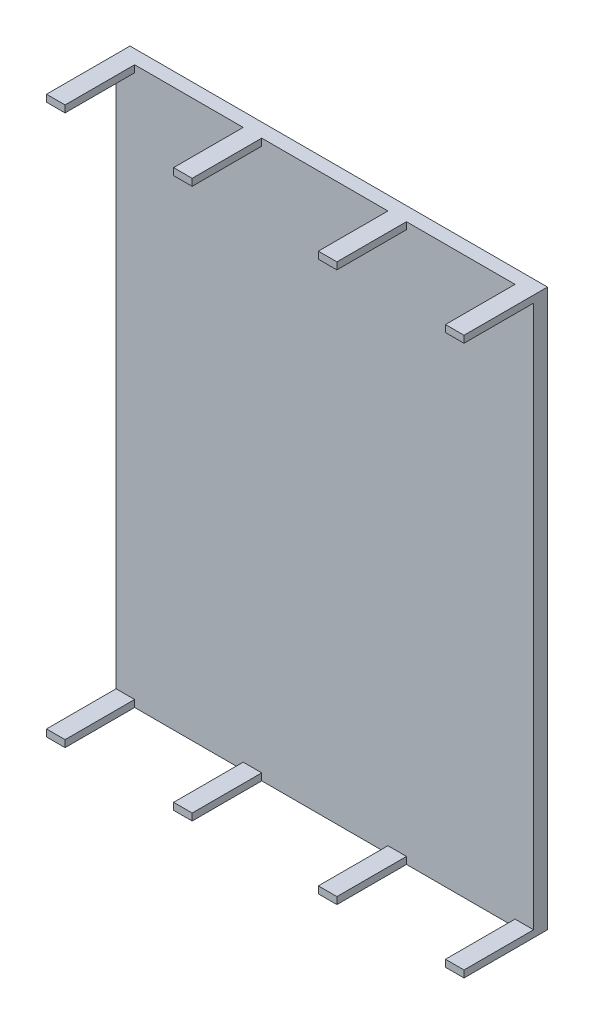
ISO-10303-21;
HEADER;
FILE_DESCRIPTION(('STEP AP214'),'2;1');
FILE_NAME('part.step','',(''),(''),'','','');
FILE_SCHEMA(('AUTOMOTIVE_DESIGN { 1 0 10303 214 1 1 1 1 }'));
ENDSEC;
DATA;
#1=APPLICATION_CONTEXT('core data for automotive mechanical design processes');
#2=APPLICATION_PROTOCOL_DEFINITION('international standard','automotive_design',2000,#1);
#3=PRODUCT_CONTEXT('',#1,'mechanical');
#4=PRODUCT('Part','Part','',(#3));
#5=PRODUCT_RELATED_PRODUCT_CATEGORY('part','',(#4));
#6=PRODUCT_DEFINITION_FORMATION('','',#4);
#7=PRODUCT_DEFINITION_CONTEXT('part definition',#1,'design');
#8=PRODUCT_DEFINITION('design','',#6,#7);
#9=PRODUCT_DEFINITION_SHAPE('','',#8);
#10=(LENGTH_UNIT() NAMED_UNIT(*) SI_UNIT(.MILLI.,.METRE.));
#11=(NAMED_UNIT(*) PLANE_ANGLE_UNIT() SI_UNIT($,.RADIAN.));
#12=(NAMED_UNIT(*) SI_UNIT($,.STERADIAN.) SOLID_ANGLE_UNIT());
#13=UNCERTAINTY_MEASURE_WITH_UNIT(LENGTH_MEASURE(1.E-05),#10,'distance_accuracy_value','');
#14=(GEOMETRIC_REPRESENTATION_CONTEXT(3) GLOBAL_UNCERTAINTY_ASSIGNED_CONTEXT((#13)) GLOBAL_UNIT_ASSIGNED_CONTEXT((#10,
#11,#12)) REPRESENTATION_CONTEXT('',''));
#15=CARTESIAN_POINT('',(0.,0.,0.));
#16=DIRECTION('',(0.,0.,1.));
#17=DIRECTION('',(1.,0.,0.));
#18=AXIS2_PLACEMENT_3D('',#15,#16,#17);
#19=CARTESIAN_POINT('',(0.,0.,3.));
#20=DIRECTION('',(0.,0.,1.));
#21=DIRECTION('',(1.,0.,0.));
#22=AXIS2_PLACEMENT_3D('',#19,#20,#21);
#23=PLANE('',#22);
#24=DIRECTION('',(0.,-1.,0.));
#25=VECTOR('',#24,1.);
#26=CARTESIAN_POINT('',(-90.,0.,3.));
#27=LINE('',#26,#25);
#28=CARTESIAN_POINT('',(-90.,-1.5,3.));
#29=VERTEX_POINT('',#28);
#30=CARTESIAN_POINT('',(-90.,-118.5,3.));
#31=VERTEX_POINT('',#30);
#32=EDGE_CURVE('E480',#29,#31,#27,.T.);
#33=ORIENTED_EDGE('',*,*,#32,.T.);
#34=DIRECTION('',(1.,0.,0.));
#35=VECTOR('',#34,1.);
#36=CARTESIAN_POINT('',(0.,-118.5,3.));
#37=LINE('',#36,#35);
#38=CARTESIAN_POINT('',(-86.,-118.5,3.));
#39=VERTEX_POINT('',#38);
#40=EDGE_CURVE('E382',#31,#39,#37,.T.);
#41=ORIENTED_EDGE('',*,*,#40,.T.);
#42=DIRECTION('',(0.,1.,0.));
#43=VECTOR('',#42,1.);
#44=CARTESIAN_POINT('',(-86.,0.,3.));
#45=LINE('',#44,#43);
#46=CARTESIAN_POINT('',(-86.,-120.,3.));
#47=VERTEX_POINT('',#46);
#48=EDGE_CURVE('E353',#47,#39,#45,.T.);
#49=ORIENTED_EDGE('',*,*,#48,.F.);
#50=DIRECTION('',(1.,0.,0.));
#51=VECTOR('',#50,1.);
#52=CARTESIAN_POINT('',(0.,-120.,3.));
#53=LINE('',#52,#51);
#54=CARTESIAN_POINT('',(-62.6,-120.,3.));
#55=VERTEX_POINT('',#54);
#56=EDGE_CURVE('E485',#47,#55,#53,.T.);
#57=ORIENTED_EDGE('',*,*,#56,.T.);
#58=DIRECTION('',(0.,1.,0.));
#59=VECTOR('',#58,1.);
#60=CARTESIAN_POINT('',(-62.6,0.,3.));
#61=LINE('',#60,#59);
#62=CARTESIAN_POINT('',(-62.6,-118.5,3.));
#63=VERTEX_POINT('',#62);
#64=EDGE_CURVE('E259',#55,#63,#61,.T.);
#65=ORIENTED_EDGE('',*,*,#64,.T.);
#66=DIRECTION('',(1.,0.,0.));
#67=VECTOR('',#66,1.);
#68=CARTESIAN_POINT('',(0.,-118.5,3.));
#69=LINE('',#68,#67);
#70=CARTESIAN_POINT('',(-58.6,-118.5,3.));
#71=VERTEX_POINT('',#70);
#72=EDGE_CURVE('E253',#63,#71,#69,.T.);
#73=ORIENTED_EDGE('',*,*,#72,.T.);
#74=DIRECTION('',(0.,1.,0.));
#75=VECTOR('',#74,1.);
#76=CARTESIAN_POINT('',(-58.6,0.,3.));
#77=LINE('',#76,#75);
#78=CARTESIAN_POINT('',(-58.6,-120.,3.));
#79=VERTEX_POINT('',#78);
#80=EDGE_CURVE('E256',#79,#71,#77,.T.);
#81=ORIENTED_EDGE('',*,*,#80,.F.);
#82=CARTESIAN_POINT('',(-31.4,-120.,3.));
#83=VERTEX_POINT('',#82);
#84=EDGE_CURVE('E484',#79,#83,#53,.T.);
#85=ORIENTED_EDGE('',*,*,#84,.T.);
#86=DIRECTION('',(0.,1.,0.));
#87=VECTOR('',#86,1.);
#88=CARTESIAN_POINT('',(-31.4000000000001,-120.,3.));
#89=LINE('',#88,#87);
#90=CARTESIAN_POINT('',(-31.4000000000001,-118.5,3.));
#91=VERTEX_POINT('',#90);
#92=EDGE_CURVE('E307',#83,#91,#89,.T.);
#93=ORIENTED_EDGE('',*,*,#92,.T.);
#94=DIRECTION('',(-1.,0.,0.));
#95=VECTOR('',#94,1.);
#96=CARTESIAN_POINT('',(-27.4000000000001,-118.5,3.));
#97=LINE('',#96,#95);
#98=CARTESIAN_POINT('',(-27.4000000000001,-118.5,3.));
#99=VERTEX_POINT('',#98);
#100=EDGE_CURVE('E309',#99,#91,#97,.T.);
#101=ORIENTED_EDGE('',*,*,#100,.F.);
#102=DIRECTION('',(0.,1.,0.));
#103=VECTOR('',#102,1.);
#104=CARTESIAN_POINT('',(-27.4000000000001,-120.,3.));
#105=LINE('',#104,#103);
#106=CARTESIAN_POINT('',(-27.4000000000001,-120.,3.));
#107=VERTEX_POINT('',#106);
#108=EDGE_CURVE('E313',#107,#99,#105,.T.);
#109=ORIENTED_EDGE('',*,*,#108,.F.);
#110=CARTESIAN_POINT('',(-4.,-120.,3.));
#111=VERTEX_POINT('',#110);
#112=EDGE_CURVE('E482',#107,#111,#53,.T.);
#113=ORIENTED_EDGE('',*,*,#112,.T.);
#114=DIRECTION('',(0.,1.,0.));
#115=VECTOR('',#114,1.);
#116=CARTESIAN_POINT('',(-4.,-120.,3.));
#117=LINE('',#116,#115);
#118=CARTESIAN_POINT('',(-4.,-118.5,3.));
#119=VERTEX_POINT('',#118);
#120=EDGE_CURVE('E335',#111,#119,#117,.T.);
#121=ORIENTED_EDGE('',*,*,#120,.T.);
#122=DIRECTION('',(-1.,0.,0.));
#123=VECTOR('',#122,1.);
#124=CARTESIAN_POINT('',(0.,-118.5,3.));
#125=LINE('',#124,#123);
#126=CARTESIAN_POINT('',(0.,-118.5,3.));
#127=VERTEX_POINT('',#126);
#128=EDGE_CURVE('E297',#127,#119,#125,.T.);
#129=ORIENTED_EDGE('',*,*,#128,.F.);
#130=DIRECTION('',(0.,1.,0.));
#131=VECTOR('',#130,1.);
#132=CARTESIAN_POINT('',(0.,0.,3.));
#133=LINE('',#132,#131);
#134=CARTESIAN_POINT('',(0.,-1.49999999999999,3.));
#135=VERTEX_POINT('',#134);
#136=EDGE_CURVE('E486',#127,#135,#133,.T.);
#137=ORIENTED_EDGE('',*,*,#136,.T.);
#138=DIRECTION('',(-1.,0.,0.));
#139=VECTOR('',#138,1.);
#140=CARTESIAN_POINT('',(0.,-1.49999999999999,3.));
#141=LINE('',#140,#139);
#142=CARTESIAN_POINT('',(-4.,-1.49999999999999,3.));
#143=VERTEX_POINT('',#142);
#144=EDGE_CURVE('E360',#135,#143,#141,.T.);
#145=ORIENTED_EDGE('',*,*,#144,.T.);
#146=DIRECTION('',(0.,-1.,0.));
#147=VECTOR('',#146,1.);
#148=CARTESIAN_POINT('',(-4.,0.,3.));
#149=LINE('',#148,#147);
#150=CARTESIAN_POINT('',(-4.,0.,3.));
#151=VERTEX_POINT('',#150);
#152=EDGE_CURVE('E362',#151,#143,#149,.T.);
#153=ORIENTED_EDGE('',*,*,#152,.F.);
#154=DIRECTION('',(-1.,0.,0.));
#155=VECTOR('',#154,1.);
#156=CARTESIAN_POINT('',(0.,0.,3.));
#157=LINE('',#156,#155);
#158=CARTESIAN_POINT('',(-27.4,0.,3.));
#159=VERTEX_POINT('',#158);
#160=EDGE_CURVE('E479',#151,#159,#157,.T.);
#161=ORIENTED_EDGE('',*,*,#160,.T.);
#162=DIRECTION('',(0.,-1.,0.));
#163=VECTOR('',#162,1.);
#164=CARTESIAN_POINT('',(-27.4,0.,3.));
#165=LINE('',#164,#163);
#166=CARTESIAN_POINT('',(-27.4,-1.5,3.));
#167=VERTEX_POINT('',#166);
#168=EDGE_CURVE('E62',#159,#167,#165,.T.);
#169=ORIENTED_EDGE('',*,*,#168,.T.);
#170=DIRECTION('',(-1.,0.,0.));
#171=VECTOR('',#170,1.);
#172=CARTESIAN_POINT('',(0.,-1.49999999999999,3.));
#173=LINE('',#172,#171);
#174=CARTESIAN_POINT('',(-31.4,-1.5,3.));
#175=VERTEX_POINT('',#174);
#176=EDGE_CURVE('E437',#167,#175,#173,.T.);
#177=ORIENTED_EDGE('',*,*,#176,.T.);
#178=DIRECTION('',(0.,-1.,0.));
#179=VECTOR('',#178,1.);
#180=CARTESIAN_POINT('',(-31.4,0.,3.));
#181=LINE('',#180,#179);
#182=CARTESIAN_POINT('',(-31.4,0.,3.));
#183=VERTEX_POINT('',#182);
#184=EDGE_CURVE('E400',#183,#175,#181,.T.);
#185=ORIENTED_EDGE('',*,*,#184,.F.);
#186=CARTESIAN_POINT('',(-58.6,0.,3.));
#187=VERTEX_POINT('',#186);
#188=EDGE_CURVE('E477',#183,#187,#157,.T.);
#189=ORIENTED_EDGE('',*,*,#188,.T.);
#190=DIRECTION('',(0.,-1.,0.));
#191=VECTOR('',#190,1.);
#192=CARTESIAN_POINT('',(-58.6,0.,3.));
#193=LINE('',#192,#191);
#194=CARTESIAN_POINT('',(-58.6,-1.5,3.));
#195=VERTEX_POINT('',#194);
#196=EDGE_CURVE('E69',#187,#195,#193,.T.);
#197=ORIENTED_EDGE('',*,*,#196,.T.);
#198=DIRECTION('',(1.,0.,0.));
#199=VECTOR('',#198,1.);
#200=CARTESIAN_POINT('',(0.,-1.5,3.));
#201=LINE('',#200,#199);
#202=CARTESIAN_POINT('',(-62.6,-1.5,3.));
#203=VERTEX_POINT('',#202);
#204=EDGE_CURVE('E409',#203,#195,#201,.T.);
#205=ORIENTED_EDGE('',*,*,#204,.F.);
#206=DIRECTION('',(0.,-1.,0.));
#207=VECTOR('',#206,1.);
#208=CARTESIAN_POINT('',(-62.6,0.,3.));
#209=LINE('',#208,#207);
#210=CARTESIAN_POINT('',(-62.6,0.,3.));
#211=VERTEX_POINT('',#210);
#212=EDGE_CURVE('E412',#211,#203,#209,.T.);
#213=ORIENTED_EDGE('',*,*,#212,.F.);
#214=CARTESIAN_POINT('',(-86.,0.,3.));
#215=VERTEX_POINT('',#214);
#216=EDGE_CURVE('E475',#211,#215,#157,.T.);
#217=ORIENTED_EDGE('',*,*,#216,.T.);
#218=DIRECTION('',(0.,-1.,0.));
#219=VECTOR('',#218,1.);
#220=CARTESIAN_POINT('',(-86.,0.,3.));
#221=LINE('',#220,#219);
#222=CARTESIAN_POINT('',(-86.,-1.5,3.));
#223=VERTEX_POINT('',#222);
#224=EDGE_CURVE('E417',#215,#223,#221,.T.);
#225=ORIENTED_EDGE('',*,*,#224,.T.);
#226=DIRECTION('',(1.,0.,0.));
#227=VECTOR('',#226,1.);
#228=CARTESIAN_POINT('',(0.,-1.5,3.));
#229=LINE('',#228,#227);
#230=EDGE_CURVE('E455',#29,#223,#229,.T.);
#231=ORIENTED_EDGE('',*,*,#230,.F.);
#232=EDGE_LOOP('',(#33,#41,#49,#57,#65,#73,#81,#85,#93,#101,#109,#113,#121,#129,#137,#145,#153,
#161,#169,#177,#185,#189,#197,#205,#213,#217,#225,#231));
#233=FACE_BOUND('',#232,.T.);
#234=ADVANCED_FACE('F47',(#233),#23,.T.);
#235=CARTESIAN_POINT('',(0.,0.,3.));
#236=DIRECTION('',(0.,-1.,0.));
#237=DIRECTION('',(0.,0.,-1.));
#238=AXIS2_PLACEMENT_3D('',#235,#236,#237);
#239=PLANE('',#238);
#240=DIRECTION('',(-1.,0.,0.));
#241=VECTOR('',#240,1.);
#242=CARTESIAN_POINT('',(0.,0.,0.));
#243=LINE('',#242,#241);
#244=CARTESIAN_POINT('',(0.,0.,0.));
#245=VERTEX_POINT('',#244);
#246=CARTESIAN_POINT('',(-90.,0.,0.));
#247=VERTEX_POINT('',#246);
#248=EDGE_CURVE('E474',#245,#247,#243,.T.);
#249=ORIENTED_EDGE('',*,*,#248,.T.);
#250=DIRECTION('',(0.,0.,-1.));
#251=VECTOR('',#250,1.);
#252=CARTESIAN_POINT('',(-90.,0.,3.));
#253=LINE('',#252,#251);
#254=CARTESIAN_POINT('',(-90.,0.,18.));
#255=VERTEX_POINT('',#254);
#256=EDGE_CURVE('E11',#255,#247,#253,.T.);
#257=ORIENTED_EDGE('',*,*,#256,.F.);
#258=DIRECTION('',(-1.,0.,0.));
#259=VECTOR('',#258,1.);
#260=CARTESIAN_POINT('',(0.,0.,18.));
#261=LINE('',#260,#259);
#262=CARTESIAN_POINT('',(-86.,0.,18.));
#263=VERTEX_POINT('',#262);
#264=EDGE_CURVE('E454',#263,#255,#261,.T.);
#265=ORIENTED_EDGE('',*,*,#264,.F.);
#266=DIRECTION('',(0.,0.,-1.));
#267=VECTOR('',#266,1.);
#268=CARTESIAN_POINT('',(-86.,0.,18.));
#269=LINE('',#268,#267);
#270=EDGE_CURVE('E471',#263,#215,#269,.T.);
#271=ORIENTED_EDGE('',*,*,#270,.T.);
#272=ORIENTED_EDGE('',*,*,#216,.F.);
#273=DIRECTION('',(0.,0.,-1.));
#274=VECTOR('',#273,1.);
#275=CARTESIAN_POINT('',(-62.6,0.,18.));
#276=LINE('',#275,#274);
#277=CARTESIAN_POINT('',(-62.6,0.,18.));
#278=VERTEX_POINT('',#277);
#279=EDGE_CURVE('E399',#278,#211,#276,.T.);
#280=ORIENTED_EDGE('',*,*,#279,.F.);
#281=DIRECTION('',(-1.,0.,0.));
#282=VECTOR('',#281,1.);
#283=CARTESIAN_POINT('',(0.,0.,18.));
#284=LINE('',#283,#282);
#285=CARTESIAN_POINT('',(-58.6,0.,18.));
#286=VERTEX_POINT('',#285);
#287=EDGE_CURVE('E421',#286,#278,#284,.T.);
#288=ORIENTED_EDGE('',*,*,#287,.F.);
#289=DIRECTION('',(0.,0.,-1.));
#290=VECTOR('',#289,1.);
#291=CARTESIAN_POINT('',(-58.6,0.,18.));
#292=LINE('',#291,#290);
#293=EDGE_CURVE('E396',#286,#187,#292,.T.);
#294=ORIENTED_EDGE('',*,*,#293,.T.);
#295=ORIENTED_EDGE('',*,*,#188,.F.);
#296=DIRECTION('',(0.,0.,-1.));
#297=VECTOR('',#296,1.);
#298=CARTESIAN_POINT('',(-31.4,0.,18.));
#299=LINE('',#298,#297);
#300=CARTESIAN_POINT('',(-31.4,0.,18.));
#301=VERTEX_POINT('',#300);
#302=EDGE_CURVE('E366',#301,#183,#299,.T.);
#303=ORIENTED_EDGE('',*,*,#302,.F.);
#304=DIRECTION('',(-1.,0.,0.));
#305=VECTOR('',#304,1.);
#306=CARTESIAN_POINT('',(0.,0.,18.));
#307=LINE('',#306,#305);
#308=CARTESIAN_POINT('',(-27.4,0.,18.));
#309=VERTEX_POINT('',#308);
#310=EDGE_CURVE('E438',#309,#301,#307,.T.);
#311=ORIENTED_EDGE('',*,*,#310,.F.);
#312=DIRECTION('',(0.,0.,-1.));
#313=VECTOR('',#312,1.);
#314=CARTESIAN_POINT('',(-27.4,0.,18.));
#315=LINE('',#314,#313);
#316=EDGE_CURVE('E432',#309,#159,#315,.T.);
#317=ORIENTED_EDGE('',*,*,#316,.T.);
#318=ORIENTED_EDGE('',*,*,#160,.F.);
#319=DIRECTION('',(0.,0.,-1.));
#320=VECTOR('',#319,1.);
#321=CARTESIAN_POINT('',(-4.,0.,18.));
#322=LINE('',#321,#320);
#323=CARTESIAN_POINT('',(-4.,0.,18.));
#324=VERTEX_POINT('',#323);
#325=EDGE_CURVE('E349',#324,#151,#322,.T.);
#326=ORIENTED_EDGE('',*,*,#325,.F.);
#327=DIRECTION('',(-1.,0.,0.));
#328=VECTOR('',#327,1.);
#329=CARTESIAN_POINT('',(0.,0.,18.));
#330=LINE('',#329,#328);
#331=CARTESIAN_POINT('',(0.,0.,18.));
#332=VERTEX_POINT('',#331);
#333=EDGE_CURVE('E363',#332,#324,#330,.T.);
#334=ORIENTED_EDGE('',*,*,#333,.F.);
#335=DIRECTION('',(0.,0.,-1.));
#336=VECTOR('',#335,1.);
#337=CARTESIAN_POINT('',(0.,0.,3.));
#338=LINE('',#337,#336);
#339=EDGE_CURVE('E488',#332,#245,#338,.T.);
#340=ORIENTED_EDGE('',*,*,#339,.T.);
#341=EDGE_LOOP('',(#249,#257,#265,#271,#272,#280,#288,#294,#295,#303,#311,#317,#318,#326,#334,#340));
#342=FACE_BOUND('',#341,.T.);
#343=ADVANCED_FACE('F49',(#342),#239,.F.);
#344=CARTESIAN_POINT('',(-90.,0.,3.));
#345=DIRECTION('',(1.,0.,0.));
#346=DIRECTION('',(0.,1.,0.));
#347=AXIS2_PLACEMENT_3D('',#344,#345,#346);
#348=PLANE('',#347);
#349=DIRECTION('',(0.,-1.,0.));
#350=VECTOR('',#349,1.);
#351=CARTESIAN_POINT('',(-90.,0.,0.));
#352=LINE('',#351,#350);
#353=CARTESIAN_POINT('',(-90.,-120.,0.));
#354=VERTEX_POINT('',#353);
#355=EDGE_CURVE('E491',#247,#354,#352,.T.);
#356=ORIENTED_EDGE('',*,*,#355,.T.);
#357=DIRECTION('',(0.,0.,-1.));
#358=VECTOR('',#357,1.);
#359=CARTESIAN_POINT('',(-90.,-120.,3.));
#360=LINE('',#359,#358);
#361=CARTESIAN_POINT('',(-90.,-120.,18.));
#362=VERTEX_POINT('',#361);
#363=EDGE_CURVE('E55',#362,#354,#360,.T.);
#364=ORIENTED_EDGE('',*,*,#363,.F.);
#365=DIRECTION('',(0.,-1.,0.));
#366=VECTOR('',#365,1.);
#367=CARTESIAN_POINT('',(-90.,0.,18.));
#368=LINE('',#367,#366);
#369=CARTESIAN_POINT('',(-90.,-118.5,18.));
#370=VERTEX_POINT('',#369);
#371=EDGE_CURVE('E381',#370,#362,#368,.T.);
#372=ORIENTED_EDGE('',*,*,#371,.F.);
#373=DIRECTION('',(0.,0.,-1.));
#374=VECTOR('',#373,1.);
#375=CARTESIAN_POINT('',(-90.,-118.5,18.));
#376=LINE('',#375,#374);
#377=EDGE_CURVE('E378',#370,#31,#376,.T.);
#378=ORIENTED_EDGE('',*,*,#377,.T.);
#379=ORIENTED_EDGE('',*,*,#32,.F.);
#380=DIRECTION('',(0.,0.,-1.));
#381=VECTOR('',#380,1.);
#382=CARTESIAN_POINT('',(-90.,-1.5,18.));
#383=LINE('',#382,#381);
#384=CARTESIAN_POINT('',(-90.,-1.5,18.));
#385=VERTEX_POINT('',#384);
#386=EDGE_CURVE('E468',#385,#29,#383,.T.);
#387=ORIENTED_EDGE('',*,*,#386,.F.);
#388=DIRECTION('',(0.,-1.,0.));
#389=VECTOR('',#388,1.);
#390=CARTESIAN_POINT('',(-90.,0.,18.));
#391=LINE('',#390,#389);
#392=EDGE_CURVE('E458',#255,#385,#391,.T.);
#393=ORIENTED_EDGE('',*,*,#392,.F.);
#394=ORIENTED_EDGE('',*,*,#256,.T.);
#395=EDGE_LOOP('',(#356,#364,#372,#378,#379,#387,#393,#394));
#396=FACE_BOUND('',#395,.T.);
#397=ADVANCED_FACE('F556',(#396),#348,.F.);
#398=CARTESIAN_POINT('',(0.,-120.,3.));
#399=DIRECTION('',(0.,1.,0.));
#400=DIRECTION('',(-1.,0.,0.));
#401=AXIS2_PLACEMENT_3D('',#398,#399,#400);
#402=PLANE('',#401);
#403=DIRECTION('',(1.,0.,0.));
#404=VECTOR('',#403,1.);
#405=CARTESIAN_POINT('',(0.,-120.,0.));
#406=LINE('',#405,#404);
#407=CARTESIAN_POINT('',(0.,-120.,0.));
#408=VERTEX_POINT('',#407);
#409=EDGE_CURVE('E493',#354,#408,#406,.T.);
#410=ORIENTED_EDGE('',*,*,#409,.T.);
#411=DIRECTION('',(0.,0.,-1.));
#412=VECTOR('',#411,1.);
#413=CARTESIAN_POINT('',(0.,-120.,3.));
#414=LINE('',#413,#412);
#415=CARTESIAN_POINT('',(0.,-120.,18.));
#416=VERTEX_POINT('',#415);
#417=EDGE_CURVE('E498',#416,#408,#414,.T.);
#418=ORIENTED_EDGE('',*,*,#417,.F.);
#419=DIRECTION('',(-1.,0.,0.));
#420=VECTOR('',#419,1.);
#421=CARTESIAN_POINT('',(0.,-120.,18.));
#422=LINE('',#421,#420);
#423=CARTESIAN_POINT('',(-4.,-120.,18.));
#424=VERTEX_POINT('',#423);
#425=EDGE_CURVE('E334',#416,#424,#422,.T.);
#426=ORIENTED_EDGE('',*,*,#425,.T.);
#427=DIRECTION('',(0.,0.,-1.));
#428=VECTOR('',#427,1.);
#429=CARTESIAN_POINT('',(-4.,-120.,18.));
#430=LINE('',#429,#428);
#431=EDGE_CURVE('E331',#424,#111,#430,.T.);
#432=ORIENTED_EDGE('',*,*,#431,.T.);
#433=ORIENTED_EDGE('',*,*,#112,.F.);
#434=DIRECTION('',(0.,0.,-1.));
#435=VECTOR('',#434,1.);
#436=CARTESIAN_POINT('',(-27.4000000000001,-120.,18.));
#437=LINE('',#436,#435);
#438=CARTESIAN_POINT('',(-27.4000000000001,-120.,18.));
#439=VERTEX_POINT('',#438);
#440=EDGE_CURVE('E303',#439,#107,#437,.T.);
#441=ORIENTED_EDGE('',*,*,#440,.F.);
#442=DIRECTION('',(-1.,0.,0.));
#443=VECTOR('',#442,1.);
#444=CARTESIAN_POINT('',(-27.4000000000001,-120.,18.));
#445=LINE('',#444,#443);
#446=CARTESIAN_POINT('',(-31.4000000000001,-120.,18.));
#447=VERTEX_POINT('',#446);
#448=EDGE_CURVE('E306',#439,#447,#445,.T.);
#449=ORIENTED_EDGE('',*,*,#448,.T.);
#450=DIRECTION('',(0.,0.,-1.));
#451=VECTOR('',#450,1.);
#452=CARTESIAN_POINT('',(-31.4000000000001,-120.,18.));
#453=LINE('',#452,#451);
#454=EDGE_CURVE('E300',#447,#83,#453,.T.);
#455=ORIENTED_EDGE('',*,*,#454,.T.);
#456=ORIENTED_EDGE('',*,*,#84,.F.);
#457=DIRECTION('',(0.,0.,-1.));
#458=VECTOR('',#457,1.);
#459=CARTESIAN_POINT('',(-58.6,-120.,18.));
#460=LINE('',#459,#458);
#461=CARTESIAN_POINT('',(-58.6,-120.,18.));
#462=VERTEX_POINT('',#461);
#463=EDGE_CURVE('E271',#462,#79,#460,.T.);
#464=ORIENTED_EDGE('',*,*,#463,.F.);
#465=DIRECTION('',(1.,0.,0.));
#466=VECTOR('',#465,1.);
#467=CARTESIAN_POINT('',(0.,-120.,18.));
#468=LINE('',#467,#466);
#469=CARTESIAN_POINT('',(-62.6,-120.,18.));
#470=VERTEX_POINT('',#469);
#471=EDGE_CURVE('E290',#470,#462,#468,.T.);
#472=ORIENTED_EDGE('',*,*,#471,.F.);
#473=DIRECTION('',(0.,0.,-1.));
#474=VECTOR('',#473,1.);
#475=CARTESIAN_POINT('',(-62.6,-120.,18.));
#476=LINE('',#475,#474);
#477=EDGE_CURVE('E286',#470,#55,#476,.T.);
#478=ORIENTED_EDGE('',*,*,#477,.T.);
#479=ORIENTED_EDGE('',*,*,#56,.F.);
#480=DIRECTION('',(0.,0.,-1.));
#481=VECTOR('',#480,1.);
#482=CARTESIAN_POINT('',(-86.,-120.,18.));
#483=LINE('',#482,#481);
#484=CARTESIAN_POINT('',(-86.,-120.,18.));
#485=VERTEX_POINT('',#484);
#486=EDGE_CURVE('E276',#485,#47,#483,.T.);
#487=ORIENTED_EDGE('',*,*,#486,.F.);
#488=DIRECTION('',(1.,0.,0.));
#489=VECTOR('',#488,1.);
#490=CARTESIAN_POINT('',(0.,-120.,18.));
#491=LINE('',#490,#489);
#492=EDGE_CURVE('E384',#362,#485,#491,.T.);
#493=ORIENTED_EDGE('',*,*,#492,.F.);
#494=ORIENTED_EDGE('',*,*,#363,.T.);
#495=EDGE_LOOP('',(#410,#418,#426,#432,#433,#441,#449,#455,#456,#464,#472,#478,#479,#487,#493,#494));
#496=FACE_BOUND('',#495,.T.);
#497=ADVANCED_FACE('F504',(#496),#402,.F.);
#498=CARTESIAN_POINT('',(0.,0.,3.));
#499=DIRECTION('',(-1.,0.,0.));
#500=DIRECTION('',(0.,-1.,0.));
#501=AXIS2_PLACEMENT_3D('',#498,#499,#500);
#502=PLANE('',#501);
#503=DIRECTION('',(0.,1.,0.));
#504=VECTOR('',#503,1.);
#505=CARTESIAN_POINT('',(0.,0.,0.));
#506=LINE('',#505,#504);
#507=EDGE_CURVE('E478',#408,#245,#506,.T.);
#508=ORIENTED_EDGE('',*,*,#507,.T.);
#509=ORIENTED_EDGE('',*,*,#339,.F.);
#510=DIRECTION('',(0.,1.,0.));
#511=VECTOR('',#510,1.);
#512=CARTESIAN_POINT('',(0.,0.,18.));
#513=LINE('',#512,#511);
#514=CARTESIAN_POINT('',(0.,-1.49999999999999,18.));
#515=VERTEX_POINT('',#514);
#516=EDGE_CURVE('E359',#515,#332,#513,.T.);
#517=ORIENTED_EDGE('',*,*,#516,.F.);
#518=DIRECTION('',(0.,0.,-1.));
#519=VECTOR('',#518,1.);
#520=CARTESIAN_POINT('',(0.,-1.49999999999999,18.));
#521=LINE('',#520,#519);
#522=EDGE_CURVE('E356',#515,#135,#521,.T.);
#523=ORIENTED_EDGE('',*,*,#522,.T.);
#524=ORIENTED_EDGE('',*,*,#136,.F.);
#525=DIRECTION('',(0.,0.,-1.));
#526=VECTOR('',#525,1.);
#527=CARTESIAN_POINT('',(0.,-118.5,18.));
#528=LINE('',#527,#526);
#529=CARTESIAN_POINT('',(0.,-118.5,18.));
#530=VERTEX_POINT('',#529);
#531=EDGE_CURVE('E325',#530,#127,#528,.T.);
#532=ORIENTED_EDGE('',*,*,#531,.F.);
#533=DIRECTION('',(0.,1.,0.));
#534=VECTOR('',#533,1.);
#535=CARTESIAN_POINT('',(0.,-120.,18.));
#536=LINE('',#535,#534);
#537=EDGE_CURVE('E337',#416,#530,#536,.T.);
#538=ORIENTED_EDGE('',*,*,#537,.F.);
#539=ORIENTED_EDGE('',*,*,#417,.T.);
#540=EDGE_LOOP('',(#508,#509,#517,#523,#524,#532,#538,#539));
#541=FACE_BOUND('',#540,.T.);
#542=ADVANCED_FACE('F513',(#541),#502,.F.);
#543=CARTESIAN_POINT('',(0.,0.,0.));
#544=DIRECTION('',(0.,0.,1.));
#545=DIRECTION('',(1.,0.,0.));
#546=AXIS2_PLACEMENT_3D('',#543,#544,#545);
#547=PLANE('',#546);
#548=ORIENTED_EDGE('',*,*,#248,.F.);
#549=ORIENTED_EDGE('',*,*,#507,.F.);
#550=ORIENTED_EDGE('',*,*,#409,.F.);
#551=ORIENTED_EDGE('',*,*,#355,.F.);
#552=EDGE_LOOP('',(#548,#549,#550,#551));
#553=FACE_BOUND('',#552,.T.);
#554=ADVANCED_FACE('F511',(#553),#547,.F.);
#555=CARTESIAN_POINT('',(-86.,0.,18.));
#556=DIRECTION('',(1.,0.,0.));
#557=DIRECTION('',(0.,0.,-1.));
#558=AXIS2_PLACEMENT_3D('',#555,#556,#557);
#559=PLANE('',#558);
#560=ORIENTED_EDGE('',*,*,#224,.F.);
#561=ORIENTED_EDGE('',*,*,#270,.F.);
#562=DIRECTION('',(0.,-1.,0.));
#563=VECTOR('',#562,1.);
#564=CARTESIAN_POINT('',(-86.,0.,18.));
#565=LINE('',#564,#563);
#566=CARTESIAN_POINT('',(-86.,-1.5,18.));
#567=VERTEX_POINT('',#566);
#568=EDGE_CURVE('E451',#263,#567,#565,.T.);
#569=ORIENTED_EDGE('',*,*,#568,.T.);
#570=DIRECTION('',(0.,0.,-1.));
#571=VECTOR('',#570,1.);
#572=CARTESIAN_POINT('',(-86.,-1.5,18.));
#573=LINE('',#572,#571);
#574=EDGE_CURVE('E462',#567,#223,#573,.T.);
#575=ORIENTED_EDGE('',*,*,#574,.T.);
#576=EDGE_LOOP('',(#560,#561,#569,#575));
#577=FACE_BOUND('',#576,.T.);
#578=ADVANCED_FACE('F559',(#577),#559,.T.);
#579=CARTESIAN_POINT('',(0.,-1.5,18.));
#580=DIRECTION('',(0.,1.,0.));
#581=DIRECTION('',(0.,0.,1.));
#582=AXIS2_PLACEMENT_3D('',#579,#580,#581);
#583=PLANE('',#582);
#584=ORIENTED_EDGE('',*,*,#230,.T.);
#585=ORIENTED_EDGE('',*,*,#574,.F.);
#586=DIRECTION('',(1.,0.,0.));
#587=VECTOR('',#586,1.);
#588=CARTESIAN_POINT('',(0.,-1.5,18.));
#589=LINE('',#588,#587);
#590=EDGE_CURVE('E460',#385,#567,#589,.T.);
#591=ORIENTED_EDGE('',*,*,#590,.F.);
#592=ORIENTED_EDGE('',*,*,#386,.T.);
#593=EDGE_LOOP('',(#584,#585,#591,#592));
#594=FACE_BOUND('',#593,.T.);
#595=ADVANCED_FACE('F623',(#594),#583,.F.);
#596=CARTESIAN_POINT('',(0.,0.,18.));
#597=DIRECTION('',(0.,0.,1.));
#598=DIRECTION('',(1.,0.,0.));
#599=AXIS2_PLACEMENT_3D('',#596,#597,#598);
#600=PLANE('',#599);
#601=ORIENTED_EDGE('',*,*,#568,.F.);
#602=ORIENTED_EDGE('',*,*,#264,.T.);
#603=ORIENTED_EDGE('',*,*,#392,.T.);
#604=ORIENTED_EDGE('',*,*,#590,.T.);
#605=EDGE_LOOP('',(#601,#602,#603,#604));
#606=FACE_BOUND('',#605,.T.);
#607=ADVANCED_FACE('F548',(#606),#600,.T.);
#608=CARTESIAN_POINT('',(0.,-118.5,18.));
#609=DIRECTION('',(0.,-1.,0.));
#610=DIRECTION('',(0.,0.,-1.));
#611=AXIS2_PLACEMENT_3D('',#608,#609,#610);
#612=PLANE('',#611);
#613=ORIENTED_EDGE('',*,*,#128,.T.);
#614=DIRECTION('',(0.,0.,-1.));
#615=VECTOR('',#614,1.);
#616=CARTESIAN_POINT('',(-4.,-118.5,18.));
#617=LINE('',#616,#615);
#618=CARTESIAN_POINT('',(-4.,-118.5,18.));
#619=VERTEX_POINT('',#618);
#620=EDGE_CURVE('E328',#619,#119,#617,.T.);
#621=ORIENTED_EDGE('',*,*,#620,.F.);
#622=DIRECTION('',(-1.,0.,0.));
#623=VECTOR('',#622,1.);
#624=CARTESIAN_POINT('',(0.,-118.5,18.));
#625=LINE('',#624,#623);
#626=EDGE_CURVE('E345',#530,#619,#625,.T.);
#627=ORIENTED_EDGE('',*,*,#626,.F.);
#628=ORIENTED_EDGE('',*,*,#531,.T.);
#629=EDGE_LOOP('',(#613,#621,#627,#628));
#630=FACE_BOUND('',#629,.T.);
#631=ADVANCED_FACE('F532',(#630),#612,.F.);
#632=CARTESIAN_POINT('',(-4.,-120.,18.));
#633=DIRECTION('',(-1.,0.,0.));
#634=DIRECTION('',(0.,0.,1.));
#635=AXIS2_PLACEMENT_3D('',#632,#633,#634);
#636=PLANE('',#635);
#637=ORIENTED_EDGE('',*,*,#120,.F.);
#638=ORIENTED_EDGE('',*,*,#431,.F.);
#639=DIRECTION('',(0.,1.,0.));
#640=VECTOR('',#639,1.);
#641=CARTESIAN_POINT('',(-4.,-120.,18.));
#642=LINE('',#641,#640);
#643=EDGE_CURVE('E342',#424,#619,#642,.T.);
#644=ORIENTED_EDGE('',*,*,#643,.T.);
#645=ORIENTED_EDGE('',*,*,#620,.T.);
#646=EDGE_LOOP('',(#637,#638,#644,#645));
#647=FACE_BOUND('',#646,.T.);
#648=ADVANCED_FACE('F539',(#647),#636,.T.);
#649=CARTESIAN_POINT('',(0.,0.,18.));
#650=DIRECTION('',(0.,0.,1.));
#651=DIRECTION('',(1.,0.,0.));
#652=AXIS2_PLACEMENT_3D('',#649,#650,#651);
#653=PLANE('',#652);
#654=ORIENTED_EDGE('',*,*,#537,.T.);
#655=ORIENTED_EDGE('',*,*,#626,.T.);
#656=ORIENTED_EDGE('',*,*,#643,.F.);
#657=ORIENTED_EDGE('',*,*,#425,.F.);
#658=EDGE_LOOP('',(#654,#655,#656,#657));
#659=FACE_BOUND('',#658,.T.);
#660=ADVANCED_FACE('F536',(#659),#653,.T.);
#661=CARTESIAN_POINT('',(-27.4000000000001,-120.,18.));
#662=DIRECTION('',(-1.,0.,0.));
#663=DIRECTION('',(0.,0.,1.));
#664=AXIS2_PLACEMENT_3D('',#661,#662,#663);
#665=PLANE('',#664);
#666=ORIENTED_EDGE('',*,*,#108,.T.);
#667=DIRECTION('',(0.,0.,-1.));
#668=VECTOR('',#667,1.);
#669=CARTESIAN_POINT('',(-27.4000000000001,-118.5,18.));
#670=LINE('',#669,#668);
#671=CARTESIAN_POINT('',(-27.4000000000001,-118.5,18.));
#672=VERTEX_POINT('',#671);
#673=EDGE_CURVE('E293',#672,#99,#670,.T.);
#674=ORIENTED_EDGE('',*,*,#673,.F.);
#675=DIRECTION('',(0.,1.,0.));
#676=VECTOR('',#675,1.);
#677=CARTESIAN_POINT('',(-27.4000000000001,-120.,18.));
#678=LINE('',#677,#676);
#679=EDGE_CURVE('E310',#439,#672,#678,.T.);
#680=ORIENTED_EDGE('',*,*,#679,.F.);
#681=ORIENTED_EDGE('',*,*,#440,.T.);
#682=EDGE_LOOP('',(#666,#674,#680,#681));
#683=FACE_BOUND('',#682,.T.);
#684=ADVANCED_FACE('F546',(#683),#665,.F.);
#685=CARTESIAN_POINT('',(-27.4000000000001,-118.5,18.));
#686=DIRECTION('',(0.,-1.,0.));
#687=DIRECTION('',(0.,0.,-1.));
#688=AXIS2_PLACEMENT_3D('',#685,#686,#687);
#689=PLANE('',#688);
#690=ORIENTED_EDGE('',*,*,#100,.T.);
#691=DIRECTION('',(0.,0.,-1.));
#692=VECTOR('',#691,1.);
#693=CARTESIAN_POINT('',(-31.4000000000001,-118.5,18.));
#694=LINE('',#693,#692);
#695=CARTESIAN_POINT('',(-31.4000000000001,-118.5,18.));
#696=VERTEX_POINT('',#695);
#697=EDGE_CURVE('E296',#696,#91,#694,.T.);
#698=ORIENTED_EDGE('',*,*,#697,.F.);
#699=DIRECTION('',(-1.,0.,0.));
#700=VECTOR('',#699,1.);
#701=CARTESIAN_POINT('',(-27.4000000000001,-118.5,18.));
#702=LINE('',#701,#700);
#703=EDGE_CURVE('E321',#672,#696,#702,.T.);
#704=ORIENTED_EDGE('',*,*,#703,.F.);
#705=ORIENTED_EDGE('',*,*,#673,.T.);
#706=EDGE_LOOP('',(#690,#698,#704,#705));
#707=FACE_BOUND('',#706,.T.);
#708=ADVANCED_FACE('F666',(#707),#689,.F.);
#709=CARTESIAN_POINT('',(-31.4000000000001,-120.,18.));
#710=DIRECTION('',(-1.,0.,0.));
#711=DIRECTION('',(0.,0.,1.));
#712=AXIS2_PLACEMENT_3D('',#709,#710,#711);
#713=PLANE('',#712);
#714=ORIENTED_EDGE('',*,*,#92,.F.);
#715=ORIENTED_EDGE('',*,*,#454,.F.);
#716=DIRECTION('',(0.,1.,0.));
#717=VECTOR('',#716,1.);
#718=CARTESIAN_POINT('',(-31.4000000000001,-120.,18.));
#719=LINE('',#718,#717);
#720=EDGE_CURVE('E318',#447,#696,#719,.T.);
#721=ORIENTED_EDGE('',*,*,#720,.T.);
#722=ORIENTED_EDGE('',*,*,#697,.T.);
#723=EDGE_LOOP('',(#714,#715,#721,#722));
#724=FACE_BOUND('',#723,.T.);
#725=ADVANCED_FACE('F670',(#724),#713,.T.);
#726=CARTESIAN_POINT('',(0.,0.,18.));
#727=DIRECTION('',(0.,0.,1.));
#728=DIRECTION('',(1.,0.,0.));
#729=AXIS2_PLACEMENT_3D('',#726,#727,#728);
#730=PLANE('',#729);
#731=ORIENTED_EDGE('',*,*,#679,.T.);
#732=ORIENTED_EDGE('',*,*,#703,.T.);
#733=ORIENTED_EDGE('',*,*,#720,.F.);
#734=ORIENTED_EDGE('',*,*,#448,.F.);
#735=EDGE_LOOP('',(#731,#732,#733,#734));
#736=FACE_BOUND('',#735,.T.);
#737=ADVANCED_FACE('F674',(#736),#730,.T.);
#738=CARTESIAN_POINT('',(-58.6,0.,18.));
#739=DIRECTION('',(-1.,0.,0.));
#740=DIRECTION('',(0.,0.,1.));
#741=AXIS2_PLACEMENT_3D('',#738,#739,#740);
#742=PLANE('',#741);
#743=ORIENTED_EDGE('',*,*,#80,.T.);
#744=DIRECTION('',(0.,0.,-1.));
#745=VECTOR('',#744,1.);
#746=CARTESIAN_POINT('',(-58.6,-118.5,18.));
#747=LINE('',#746,#745);
#748=CARTESIAN_POINT('',(-58.6,-118.5,18.));
#749=VERTEX_POINT('',#748);
#750=EDGE_CURVE('E265',#749,#71,#747,.T.);
#751=ORIENTED_EDGE('',*,*,#750,.F.);
#752=DIRECTION('',(0.,1.,0.));
#753=VECTOR('',#752,1.);
#754=CARTESIAN_POINT('',(-58.6,0.,18.));
#755=LINE('',#754,#753);
#756=EDGE_CURVE('E288',#462,#749,#755,.T.);
#757=ORIENTED_EDGE('',*,*,#756,.F.);
#758=ORIENTED_EDGE('',*,*,#463,.T.);
#759=EDGE_LOOP('',(#743,#751,#757,#758));
#760=FACE_BOUND('',#759,.T.);
#761=ADVANCED_FACE('F274',(#760),#742,.F.);
#762=CARTESIAN_POINT('',(0.,-118.5,18.));
#763=DIRECTION('',(0.,1.,0.));
#764=DIRECTION('',(0.,0.,1.));
#765=AXIS2_PLACEMENT_3D('',#762,#763,#764);
#766=PLANE('',#765);
#767=ORIENTED_EDGE('',*,*,#72,.F.);
#768=DIRECTION('',(0.,0.,-1.));
#769=VECTOR('',#768,1.);
#770=CARTESIAN_POINT('',(-62.6,-118.5,18.));
#771=LINE('',#770,#769);
#772=CARTESIAN_POINT('',(-62.6,-118.5,18.));
#773=VERTEX_POINT('',#772);
#774=EDGE_CURVE('E270',#773,#63,#771,.T.);
#775=ORIENTED_EDGE('',*,*,#774,.F.);
#776=DIRECTION('',(1.,0.,0.));
#777=VECTOR('',#776,1.);
#778=CARTESIAN_POINT('',(0.,-118.5,18.));
#779=LINE('',#778,#777);
#780=EDGE_CURVE('E268',#773,#749,#779,.T.);
#781=ORIENTED_EDGE('',*,*,#780,.T.);
#782=ORIENTED_EDGE('',*,*,#750,.T.);
#783=EDGE_LOOP('',(#767,#775,#781,#782));
#784=FACE_BOUND('',#783,.T.);
#785=ADVANCED_FACE('F266',(#784),#766,.T.);
#786=CARTESIAN_POINT('',(-62.6,0.,18.));
#787=DIRECTION('',(-1.,0.,0.));
#788=DIRECTION('',(0.,0.,1.));
#789=AXIS2_PLACEMENT_3D('',#786,#787,#788);
#790=PLANE('',#789);
#791=ORIENTED_EDGE('',*,*,#64,.F.);
#792=ORIENTED_EDGE('',*,*,#477,.F.);
#793=DIRECTION('',(0.,1.,0.));
#794=VECTOR('',#793,1.);
#795=CARTESIAN_POINT('',(-62.6,0.,18.));
#796=LINE('',#795,#794);
#797=EDGE_CURVE('E283',#470,#773,#796,.T.);
#798=ORIENTED_EDGE('',*,*,#797,.T.);
#799=ORIENTED_EDGE('',*,*,#774,.T.);
#800=EDGE_LOOP('',(#791,#792,#798,#799));
#801=FACE_BOUND('',#800,.T.);
#802=ADVANCED_FACE('F654',(#801),#790,.T.);
#803=CARTESIAN_POINT('',(0.,0.,18.));
#804=DIRECTION('',(0.,0.,1.));
#805=DIRECTION('',(1.,0.,0.));
#806=AXIS2_PLACEMENT_3D('',#803,#804,#805);
#807=PLANE('',#806);
#808=ORIENTED_EDGE('',*,*,#471,.T.);
#809=ORIENTED_EDGE('',*,*,#756,.T.);
#810=ORIENTED_EDGE('',*,*,#780,.F.);
#811=ORIENTED_EDGE('',*,*,#797,.F.);
#812=EDGE_LOOP('',(#808,#809,#810,#811));
#813=FACE_BOUND('',#812,.T.);
#814=ADVANCED_FACE('F650',(#813),#807,.T.);
#815=CARTESIAN_POINT('',(-58.6,0.,18.));
#816=DIRECTION('',(1.,0.,0.));
#817=DIRECTION('',(0.,0.,-1.));
#818=AXIS2_PLACEMENT_3D('',#815,#816,#817);
#819=PLANE('',#818);
#820=ORIENTED_EDGE('',*,*,#196,.F.);
#821=ORIENTED_EDGE('',*,*,#293,.F.);
#822=DIRECTION('',(0.,-1.,0.));
#823=VECTOR('',#822,1.);
#824=CARTESIAN_POINT('',(-58.6,0.,18.));
#825=LINE('',#824,#823);
#826=CARTESIAN_POINT('',(-58.6,-1.5,18.));
#827=VERTEX_POINT('',#826);
#828=EDGE_CURVE('E413',#286,#827,#825,.T.);
#829=ORIENTED_EDGE('',*,*,#828,.T.);
#830=DIRECTION('',(0.,0.,-1.));
#831=VECTOR('',#830,1.);
#832=CARTESIAN_POINT('',(-58.6,-1.5,18.));
#833=LINE('',#832,#831);
#834=EDGE_CURVE('E406',#827,#195,#833,.T.);
#835=ORIENTED_EDGE('',*,*,#834,.T.);
#836=EDGE_LOOP('',(#820,#821,#829,#835));
#837=FACE_BOUND('',#836,.T.);
#838=ADVANCED_FACE('F592',(#837),#819,.T.);
#839=CARTESIAN_POINT('',(-62.6,0.,18.));
#840=DIRECTION('',(1.,0.,0.));
#841=DIRECTION('',(0.,0.,-1.));
#842=AXIS2_PLACEMENT_3D('',#839,#840,#841);
#843=PLANE('',#842);
#844=ORIENTED_EDGE('',*,*,#212,.T.);
#845=DIRECTION('',(0.,0.,-1.));
#846=VECTOR('',#845,1.);
#847=CARTESIAN_POINT('',(-62.6,-1.5,18.));
#848=LINE('',#847,#846);
#849=CARTESIAN_POINT('',(-62.6,-1.5,18.));
#850=VERTEX_POINT('',#849);
#851=EDGE_CURVE('E403',#850,#203,#848,.T.);
#852=ORIENTED_EDGE('',*,*,#851,.F.);
#853=DIRECTION('',(0.,-1.,0.));
#854=VECTOR('',#853,1.);
#855=CARTESIAN_POINT('',(-62.6,0.,18.));
#856=LINE('',#855,#854);
#857=EDGE_CURVE('E419',#278,#850,#856,.T.);
#858=ORIENTED_EDGE('',*,*,#857,.F.);
#859=ORIENTED_EDGE('',*,*,#279,.T.);
#860=EDGE_LOOP('',(#844,#852,#858,#859));
#861=FACE_BOUND('',#860,.T.);
#862=ADVANCED_FACE('F582',(#861),#843,.F.);
#863=CARTESIAN_POINT('',(0.,-1.5,18.));
#864=DIRECTION('',(0.,1.,0.));
#865=DIRECTION('',(0.,0.,1.));
#866=AXIS2_PLACEMENT_3D('',#863,#864,#865);
#867=PLANE('',#866);
#868=ORIENTED_EDGE('',*,*,#204,.T.);
#869=ORIENTED_EDGE('',*,*,#834,.F.);
#870=DIRECTION('',(1.,0.,0.));
#871=VECTOR('',#870,1.);
#872=CARTESIAN_POINT('',(0.,-1.5,18.));
#873=LINE('',#872,#871);
#874=EDGE_CURVE('E408',#850,#827,#873,.T.);
#875=ORIENTED_EDGE('',*,*,#874,.F.);
#876=ORIENTED_EDGE('',*,*,#851,.T.);
#877=EDGE_LOOP('',(#868,#869,#875,#876));
#878=FACE_BOUND('',#877,.T.);
#879=ADVANCED_FACE('F594',(#878),#867,.F.);
#880=CARTESIAN_POINT('',(0.,0.,18.));
#881=DIRECTION('',(0.,0.,1.));
#882=DIRECTION('',(1.,0.,0.));
#883=AXIS2_PLACEMENT_3D('',#880,#881,#882);
#884=PLANE('',#883);
#885=ORIENTED_EDGE('',*,*,#828,.F.);
#886=ORIENTED_EDGE('',*,*,#287,.T.);
#887=ORIENTED_EDGE('',*,*,#857,.T.);
#888=ORIENTED_EDGE('',*,*,#874,.T.);
#889=EDGE_LOOP('',(#885,#886,#887,#888));
#890=FACE_BOUND('',#889,.T.);
#891=ADVANCED_FACE('F587',(#890),#884,.T.);
#892=CARTESIAN_POINT('',(-31.4,0.,18.));
#893=DIRECTION('',(1.,0.,0.));
#894=DIRECTION('',(0.,0.,-1.));
#895=AXIS2_PLACEMENT_3D('',#892,#893,#894);
#896=PLANE('',#895);
#897=ORIENTED_EDGE('',*,*,#184,.T.);
#898=DIRECTION('',(0.,0.,-1.));
#899=VECTOR('',#898,1.);
#900=CARTESIAN_POINT('',(-31.4,-1.5,18.));
#901=LINE('',#900,#899);
#902=CARTESIAN_POINT('',(-31.4,-1.5,18.));
#903=VERTEX_POINT('',#902);
#904=EDGE_CURVE('E427',#903,#175,#901,.T.);
#905=ORIENTED_EDGE('',*,*,#904,.F.);
#906=DIRECTION('',(0.,-1.,0.));
#907=VECTOR('',#906,1.);
#908=CARTESIAN_POINT('',(-31.4,0.,18.));
#909=LINE('',#908,#907);
#910=EDGE_CURVE('E447',#301,#903,#909,.T.);
#911=ORIENTED_EDGE('',*,*,#910,.F.);
#912=ORIENTED_EDGE('',*,*,#302,.T.);
#913=EDGE_LOOP('',(#897,#905,#911,#912));
#914=FACE_BOUND('',#913,.T.);
#915=ADVANCED_FACE('F601',(#914),#896,.F.);
#916=CARTESIAN_POINT('',(0.,-1.49999999999999,18.));
#917=DIRECTION('',(0.,-1.,0.));
#918=DIRECTION('',(1.,0.,0.));
#919=AXIS2_PLACEMENT_3D('',#916,#917,#918);
#920=PLANE('',#919);
#921=ORIENTED_EDGE('',*,*,#176,.F.);
#922=DIRECTION('',(0.,0.,-1.));
#923=VECTOR('',#922,1.);
#924=CARTESIAN_POINT('',(-27.4,-1.5,18.));
#925=LINE('',#924,#923);
#926=CARTESIAN_POINT('',(-27.4,-1.5,18.));
#927=VERTEX_POINT('',#926);
#928=EDGE_CURVE('E430',#927,#167,#925,.T.);
#929=ORIENTED_EDGE('',*,*,#928,.F.);
#930=DIRECTION('',(-1.,0.,0.));
#931=VECTOR('',#930,1.);
#932=CARTESIAN_POINT('',(0.,-1.49999999999999,18.));
#933=LINE('',#932,#931);
#934=EDGE_CURVE('E444',#927,#903,#933,.T.);
#935=ORIENTED_EDGE('',*,*,#934,.T.);
#936=ORIENTED_EDGE('',*,*,#904,.T.);
#937=EDGE_LOOP('',(#921,#929,#935,#936));
#938=FACE_BOUND('',#937,.T.);
#939=ADVANCED_FACE('F608',(#938),#920,.T.);
#940=CARTESIAN_POINT('',(-27.4,0.,18.));
#941=DIRECTION('',(1.,0.,0.));
#942=DIRECTION('',(0.,0.,-1.));
#943=AXIS2_PLACEMENT_3D('',#940,#941,#942);
#944=PLANE('',#943);
#945=ORIENTED_EDGE('',*,*,#168,.F.);
#946=ORIENTED_EDGE('',*,*,#316,.F.);
#947=DIRECTION('',(0.,-1.,0.));
#948=VECTOR('',#947,1.);
#949=CARTESIAN_POINT('',(-27.4,0.,18.));
#950=LINE('',#949,#948);
#951=EDGE_CURVE('E435',#309,#927,#950,.T.);
#952=ORIENTED_EDGE('',*,*,#951,.T.);
#953=ORIENTED_EDGE('',*,*,#928,.T.);
#954=EDGE_LOOP('',(#945,#946,#952,#953));
#955=FACE_BOUND('',#954,.T.);
#956=ADVANCED_FACE('F612',(#955),#944,.T.);
#957=CARTESIAN_POINT('',(0.,0.,18.));
#958=DIRECTION('',(0.,0.,1.));
#959=DIRECTION('',(1.,0.,0.));
#960=AXIS2_PLACEMENT_3D('',#957,#958,#959);
#961=PLANE('',#960);
#962=ORIENTED_EDGE('',*,*,#310,.T.);
#963=ORIENTED_EDGE('',*,*,#910,.T.);
#964=ORIENTED_EDGE('',*,*,#934,.F.);
#965=ORIENTED_EDGE('',*,*,#951,.F.);
#966=EDGE_LOOP('',(#962,#963,#964,#965));
#967=FACE_BOUND('',#966,.T.);
#968=ADVANCED_FACE('F616',(#967),#961,.T.);
#969=CARTESIAN_POINT('',(-4.,0.,18.));
#970=DIRECTION('',(1.,0.,0.));
#971=DIRECTION('',(0.,0.,-1.));
#972=AXIS2_PLACEMENT_3D('',#969,#970,#971);
#973=PLANE('',#972);
#974=ORIENTED_EDGE('',*,*,#152,.T.);
#975=DIRECTION('',(0.,0.,-1.));
#976=VECTOR('',#975,1.);
#977=CARTESIAN_POINT('',(-4.,-1.49999999999999,18.));
#978=LINE('',#977,#976);
#979=CARTESIAN_POINT('',(-4.,-1.49999999999999,18.));
#980=VERTEX_POINT('',#979);
#981=EDGE_CURVE('E352',#980,#143,#978,.T.);
#982=ORIENTED_EDGE('',*,*,#981,.F.);
#983=DIRECTION('',(0.,-1.,0.));
#984=VECTOR('',#983,1.);
#985=CARTESIAN_POINT('',(-4.,0.,18.));
#986=LINE('',#985,#984);
#987=EDGE_CURVE('E372',#324,#980,#986,.T.);
#988=ORIENTED_EDGE('',*,*,#987,.F.);
#989=ORIENTED_EDGE('',*,*,#325,.T.);
#990=EDGE_LOOP('',(#974,#982,#988,#989));
#991=FACE_BOUND('',#990,.T.);
#992=ADVANCED_FACE('F620',(#991),#973,.F.);
#993=CARTESIAN_POINT('',(0.,-1.49999999999999,18.));
#994=DIRECTION('',(0.,-1.,0.));
#995=DIRECTION('',(1.,0.,0.));
#996=AXIS2_PLACEMENT_3D('',#993,#994,#995);
#997=PLANE('',#996);
#998=ORIENTED_EDGE('',*,*,#144,.F.);
#999=ORIENTED_EDGE('',*,*,#522,.F.);
#1000=DIRECTION('',(-1.,0.,0.));
#1001=VECTOR('',#1000,1.);
#1002=CARTESIAN_POINT('',(0.,-1.49999999999999,18.));
#1003=LINE('',#1002,#1001);
#1004=EDGE_CURVE('E369',#515,#980,#1003,.T.);
#1005=ORIENTED_EDGE('',*,*,#1004,.T.);
#1006=ORIENTED_EDGE('',*,*,#981,.T.);
#1007=EDGE_LOOP('',(#998,#999,#1005,#1006));
#1008=FACE_BOUND('',#1007,.T.);
#1009=ADVANCED_FACE('F528',(#1008),#997,.T.);
#1010=CARTESIAN_POINT('',(0.,0.,18.));
#1011=DIRECTION('',(0.,0.,1.));
#1012=DIRECTION('',(1.,0.,0.));
#1013=AXIS2_PLACEMENT_3D('',#1010,#1011,#1012);
#1014=PLANE('',#1013);
#1015=ORIENTED_EDGE('',*,*,#333,.T.);
#1016=ORIENTED_EDGE('',*,*,#987,.T.);
#1017=ORIENTED_EDGE('',*,*,#1004,.F.);
#1018=ORIENTED_EDGE('',*,*,#516,.T.);
#1019=EDGE_LOOP('',(#1015,#1016,#1017,#1018));
#1020=FACE_BOUND('',#1019,.T.);
#1021=ADVANCED_FACE('F521',(#1020),#1014,.T.);
#1022=CARTESIAN_POINT('',(-86.,0.,18.));
#1023=DIRECTION('',(-1.,0.,0.));
#1024=DIRECTION('',(0.,0.,1.));
#1025=AXIS2_PLACEMENT_3D('',#1022,#1023,#1024);
#1026=PLANE('',#1025);
#1027=ORIENTED_EDGE('',*,*,#48,.T.);
#1028=DIRECTION('',(0.,0.,-1.));
#1029=VECTOR('',#1028,1.);
#1030=CARTESIAN_POINT('',(-86.,-118.5,18.));
#1031=LINE('',#1030,#1029);
#1032=CARTESIAN_POINT('',(-86.,-118.5,18.));
#1033=VERTEX_POINT('',#1032);
#1034=EDGE_CURVE('E279',#1033,#39,#1031,.T.);
#1035=ORIENTED_EDGE('',*,*,#1034,.F.);
#1036=DIRECTION('',(0.,1.,0.));
#1037=VECTOR('',#1036,1.);
#1038=CARTESIAN_POINT('',(-86.,0.,18.));
#1039=LINE('',#1038,#1037);
#1040=EDGE_CURVE('E392',#485,#1033,#1039,.T.);
#1041=ORIENTED_EDGE('',*,*,#1040,.F.);
#1042=ORIENTED_EDGE('',*,*,#486,.T.);
#1043=EDGE_LOOP('',(#1027,#1035,#1041,#1042));
#1044=FACE_BOUND('',#1043,.T.);
#1045=ADVANCED_FACE('F639',(#1044),#1026,.F.);
#1046=CARTESIAN_POINT('',(0.,-118.5,18.));
#1047=DIRECTION('',(0.,1.,0.));
#1048=DIRECTION('',(0.,0.,1.));
#1049=AXIS2_PLACEMENT_3D('',#1046,#1047,#1048);
#1050=PLANE('',#1049);
#1051=ORIENTED_EDGE('',*,*,#40,.F.);
#1052=ORIENTED_EDGE('',*,*,#377,.F.);
#1053=DIRECTION('',(1.,0.,0.));
#1054=VECTOR('',#1053,1.);
#1055=CARTESIAN_POINT('',(0.,-118.5,18.));
#1056=LINE('',#1055,#1054);
#1057=EDGE_CURVE('E389',#370,#1033,#1056,.T.);
#1058=ORIENTED_EDGE('',*,*,#1057,.T.);
#1059=ORIENTED_EDGE('',*,*,#1034,.T.);
#1060=EDGE_LOOP('',(#1051,#1052,#1058,#1059));
#1061=FACE_BOUND('',#1060,.T.);
#1062=ADVANCED_FACE('F633',(#1061),#1050,.T.);
#1063=CARTESIAN_POINT('',(0.,0.,18.));
#1064=DIRECTION('',(0.,0.,1.));
#1065=DIRECTION('',(1.,0.,0.));
#1066=AXIS2_PLACEMENT_3D('',#1063,#1064,#1065);
#1067=PLANE('',#1066);
#1068=ORIENTED_EDGE('',*,*,#492,.T.);
#1069=ORIENTED_EDGE('',*,*,#1040,.T.);
#1070=ORIENTED_EDGE('',*,*,#1057,.F.);
#1071=ORIENTED_EDGE('',*,*,#371,.T.);
#1072=EDGE_LOOP('',(#1068,#1069,#1070,#1071));
#1073=FACE_BOUND('',#1072,.T.);
#1074=ADVANCED_FACE('F641',(#1073),#1067,.T.);
#1075=CLOSED_SHELL('',(#234,#343,#397,#497,#542,#554,#578,#595,#607,#631,#648,#660,#684,#708,
#725,#737,#761,#785,#802,#814,#838,#862,#879,#891,#915,#939,#956,#968,#992,#1009,#1021,#1045,
#1062,#1074));
#1076=MANIFOLD_SOLID_BREP('B2',#1075);
#1077=ADVANCED_BREP_SHAPE_REPRESENTATION('',(#18,#1076),#14);
#1078=SHAPE_DEFINITION_REPRESENTATION(#9,#1077);
ENDSEC;
END-ISO-10303-21;
